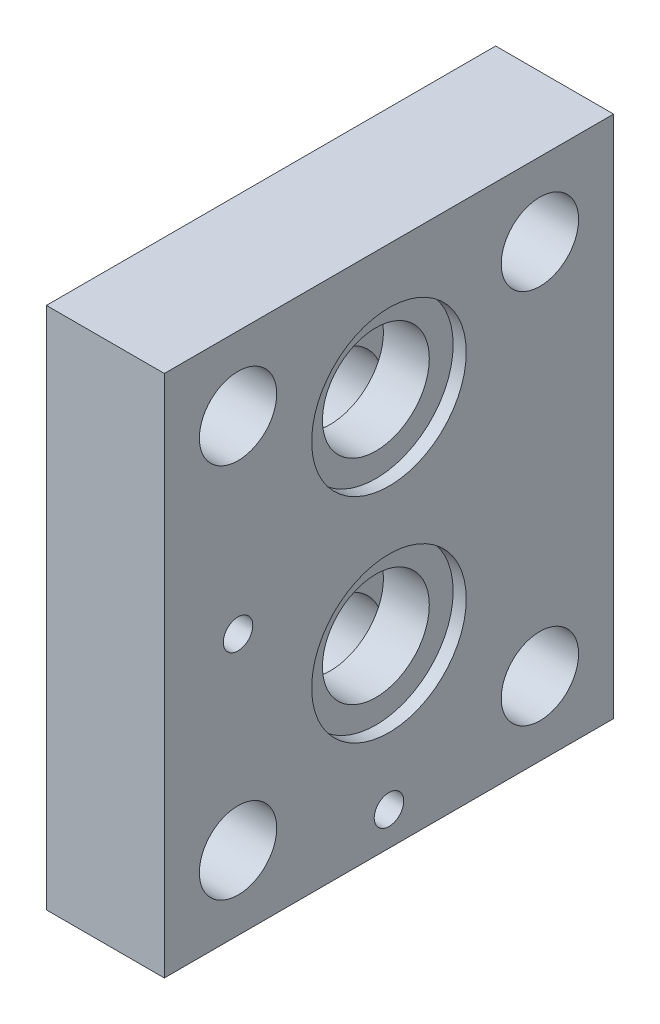
ISO-10303-21;
HEADER;
FILE_DESCRIPTION(('STEP AP214'),'2;1');
FILE_NAME('part.step','',(''),(''),'','','');
FILE_SCHEMA(('AUTOMOTIVE_DESIGN { 1 0 10303 214 1 1 1 1 }'));
ENDSEC;
DATA;
#1=APPLICATION_CONTEXT('core data for automotive mechanical design processes');
#2=APPLICATION_PROTOCOL_DEFINITION('international standard','automotive_design',2000,#1);
#3=PRODUCT_CONTEXT('',#1,'mechanical');
#4=PRODUCT('Part','Part','',(#3));
#5=PRODUCT_RELATED_PRODUCT_CATEGORY('part','',(#4));
#6=PRODUCT_DEFINITION_FORMATION('','',#4);
#7=PRODUCT_DEFINITION_CONTEXT('part definition',#1,'design');
#8=PRODUCT_DEFINITION('design','',#6,#7);
#9=PRODUCT_DEFINITION_SHAPE('','',#8);
#10=(LENGTH_UNIT() NAMED_UNIT(*) SI_UNIT(.MILLI.,.METRE.));
#11=(NAMED_UNIT(*) PLANE_ANGLE_UNIT() SI_UNIT($,.RADIAN.));
#12=(NAMED_UNIT(*) SI_UNIT($,.STERADIAN.) SOLID_ANGLE_UNIT());
#13=UNCERTAINTY_MEASURE_WITH_UNIT(LENGTH_MEASURE(1.E-05),#10,'distance_accuracy_value','');
#14=(GEOMETRIC_REPRESENTATION_CONTEXT(3) GLOBAL_UNCERTAINTY_ASSIGNED_CONTEXT((#13)) GLOBAL_UNIT_ASSIGNED_CONTEXT((#10,
#11,#12)) REPRESENTATION_CONTEXT('',''));
#15=CARTESIAN_POINT('',(0.,0.,0.));
#16=DIRECTION('',(0.,0.,1.));
#17=DIRECTION('',(1.,0.,0.));
#18=AXIS2_PLACEMENT_3D('',#15,#16,#17);
#19=CARTESIAN_POINT('',(12.7,84.201,48.387));
#20=DIRECTION('',(1.,0.,0.));
#21=DIRECTION('',(0.,0.,-1.));
#22=AXIS2_PLACEMENT_3D('',#19,#20,#21);
#23=CYLINDRICAL_SURFACE('',#22,11.509375);
#24=CARTESIAN_POINT('',(12.7,84.201,48.387));
#25=DIRECTION('',(1.,0.,0.));
#26=DIRECTION('',(0.,0.,-1.));
#27=AXIS2_PLACEMENT_3D('',#24,#25,#26);
#28=CIRCLE('',#27,11.509375);
#29=CARTESIAN_POINT('',(12.7,79.375,58.8357050341478));
#30=VERTEX_POINT('',#29);
#31=CARTESIAN_POINT('',(12.7,79.375,37.9382949658522));
#32=VERTEX_POINT('',#31);
#33=EDGE_CURVE('E100',#30,#32,#28,.T.);
#34=ORIENTED_EDGE('',*,*,#33,.F.);
#35=EDGE_CURVE('E59',#32,#30,#28,.T.);
#36=ORIENTED_EDGE('',*,*,#35,.F.);
#37=EDGE_LOOP('',(#34,#36));
#38=FACE_BOUND('',#37,.T.);
#39=CARTESIAN_POINT('',(22.5806,84.201,48.387));
#40=DIRECTION('',(1.,0.,0.));
#41=DIRECTION('',(0.,0.,-1.));
#42=AXIS2_PLACEMENT_3D('',#39,#40,#41);
#43=CIRCLE('',#42,11.509375);
#44=CARTESIAN_POINT('',(22.5806,84.201,36.877625));
#45=VERTEX_POINT('',#44);
#46=EDGE_CURVE('E47',#45,#45,#43,.F.);
#47=ORIENTED_EDGE('',*,*,#46,.F.);
#48=EDGE_LOOP('',(#47));
#49=FACE_BOUND('',#48,.T.);
#50=ADVANCED_FACE('F43',(#38,#49),#23,.F.);
#51=CARTESIAN_POINT('',(12.7,38.227,48.387));
#52=DIRECTION('',(1.,0.,0.));
#53=DIRECTION('',(0.,0.,-1.));
#54=AXIS2_PLACEMENT_3D('',#51,#52,#53);
#55=CYLINDRICAL_SURFACE('',#54,11.509375);
#56=CARTESIAN_POINT('',(12.7,38.227,48.387));
#57=DIRECTION('',(1.,0.,0.));
#58=DIRECTION('',(0.,0.,-1.));
#59=AXIS2_PLACEMENT_3D('',#56,#57,#58);
#60=CIRCLE('',#59,11.509375);
#61=CARTESIAN_POINT('',(12.7,33.401,58.8357050341478));
#62=VERTEX_POINT('',#61);
#63=CARTESIAN_POINT('',(12.7,33.401,37.9382949658522));
#64=VERTEX_POINT('',#63);
#65=EDGE_CURVE('E120',#62,#64,#60,.T.);
#66=ORIENTED_EDGE('',*,*,#65,.F.);
#67=EDGE_CURVE('E66',#64,#62,#60,.T.);
#68=ORIENTED_EDGE('',*,*,#67,.F.);
#69=EDGE_LOOP('',(#66,#68));
#70=FACE_BOUND('',#69,.T.);
#71=CARTESIAN_POINT('',(22.5806,38.227,48.387));
#72=DIRECTION('',(1.,0.,0.));
#73=DIRECTION('',(0.,0.,-1.));
#74=AXIS2_PLACEMENT_3D('',#71,#72,#73);
#75=CIRCLE('',#74,11.509375);
#76=CARTESIAN_POINT('',(22.5806,38.227,36.877625));
#77=VERTEX_POINT('',#76);
#78=EDGE_CURVE('E101',#77,#77,#75,.F.);
#79=ORIENTED_EDGE('',*,*,#78,.F.);
#80=EDGE_LOOP('',(#79));
#81=FACE_BOUND('',#80,.T.);
#82=ADVANCED_FACE('F279',(#70,#81),#55,.F.);
#83=CARTESIAN_POINT('',(25.4,0.,0.));
#84=DIRECTION('',(0.,1.,0.));
#85=DIRECTION('',(0.,0.,1.));
#86=AXIS2_PLACEMENT_3D('',#83,#84,#85);
#87=PLANE('',#86);
#88=DIRECTION('',(0.,0.,-1.));
#89=VECTOR('',#88,1.);
#90=CARTESIAN_POINT('',(0.,0.,0.));
#91=LINE('',#90,#89);
#92=CARTESIAN_POINT('',(0.,0.,96.774));
#93=VERTEX_POINT('',#92);
#94=CARTESIAN_POINT('',(0.,0.,0.));
#95=VERTEX_POINT('',#94);
#96=EDGE_CURVE('E148',#93,#95,#91,.T.);
#97=ORIENTED_EDGE('',*,*,#96,.T.);
#98=DIRECTION('',(-1.,0.,0.));
#99=VECTOR('',#98,1.);
#100=CARTESIAN_POINT('',(25.4,0.,0.));
#101=LINE('',#100,#99);
#102=CARTESIAN_POINT('',(25.4,0.,0.));
#103=VERTEX_POINT('',#102);
#104=EDGE_CURVE('E11',#103,#95,#101,.T.);
#105=ORIENTED_EDGE('',*,*,#104,.F.);
#106=DIRECTION('',(0.,0.,-1.));
#107=VECTOR('',#106,1.);
#108=CARTESIAN_POINT('',(25.4,0.,0.));
#109=LINE('',#108,#107);
#110=CARTESIAN_POINT('',(25.4,0.,96.774));
#111=VERTEX_POINT('',#110);
#112=EDGE_CURVE('E151',#111,#103,#109,.T.);
#113=ORIENTED_EDGE('',*,*,#112,.F.);
#114=DIRECTION('',(-1.,0.,0.));
#115=VECTOR('',#114,1.);
#116=CARTESIAN_POINT('',(25.4,0.,96.774));
#117=LINE('',#116,#115);
#118=EDGE_CURVE('E161',#111,#93,#117,.T.);
#119=ORIENTED_EDGE('',*,*,#118,.T.);
#120=EDGE_LOOP('',(#97,#105,#113,#119));
#121=FACE_BOUND('',#120,.T.);
#122=ADVANCED_FACE('F45',(#121),#87,.F.);
#123=CARTESIAN_POINT('',(25.4,0.,0.));
#124=DIRECTION('',(0.,0.,1.));
#125=DIRECTION('',(1.,0.,0.));
#126=AXIS2_PLACEMENT_3D('',#123,#124,#125);
#127=PLANE('',#126);
#128=DIRECTION('',(0.,1.,0.));
#129=VECTOR('',#128,1.);
#130=CARTESIAN_POINT('',(0.,0.,0.));
#131=LINE('',#130,#129);
#132=CARTESIAN_POINT('',(0.,112.776,0.));
#133=VERTEX_POINT('',#132);
#134=EDGE_CURVE('E164',#95,#133,#131,.T.);
#135=ORIENTED_EDGE('',*,*,#134,.T.);
#136=DIRECTION('',(-1.,0.,0.));
#137=VECTOR('',#136,1.);
#138=CARTESIAN_POINT('',(25.4,112.776,0.));
#139=LINE('',#138,#137);
#140=CARTESIAN_POINT('',(25.4,112.776,0.));
#141=VERTEX_POINT('',#140);
#142=EDGE_CURVE('E52',#141,#133,#139,.T.);
#143=ORIENTED_EDGE('',*,*,#142,.F.);
#144=DIRECTION('',(0.,1.,0.));
#145=VECTOR('',#144,1.);
#146=CARTESIAN_POINT('',(25.4,0.,0.));
#147=LINE('',#146,#145);
#148=EDGE_CURVE('E154',#103,#141,#147,.T.);
#149=ORIENTED_EDGE('',*,*,#148,.F.);
#150=ORIENTED_EDGE('',*,*,#104,.T.);
#151=EDGE_LOOP('',(#135,#143,#149,#150));
#152=FACE_BOUND('',#151,.T.);
#153=ADVANCED_FACE('F255',(#152),#127,.F.);
#154=CARTESIAN_POINT('',(25.4,112.776,0.));
#155=DIRECTION('',(0.,-1.,0.));
#156=DIRECTION('',(0.,0.,-1.));
#157=AXIS2_PLACEMENT_3D('',#154,#155,#156);
#158=PLANE('',#157);
#159=DIRECTION('',(0.,0.,1.));
#160=VECTOR('',#159,1.);
#161=CARTESIAN_POINT('',(0.,112.776,0.));
#162=LINE('',#161,#160);
#163=CARTESIAN_POINT('',(0.,112.776,96.774));
#164=VERTEX_POINT('',#163);
#165=EDGE_CURVE('E166',#133,#164,#162,.T.);
#166=ORIENTED_EDGE('',*,*,#165,.T.);
#167=DIRECTION('',(-1.,0.,0.));
#168=VECTOR('',#167,1.);
#169=CARTESIAN_POINT('',(25.4,112.776,96.774));
#170=LINE('',#169,#168);
#171=CARTESIAN_POINT('',(25.4,112.776,96.774));
#172=VERTEX_POINT('',#171);
#173=EDGE_CURVE('E171',#172,#164,#170,.T.);
#174=ORIENTED_EDGE('',*,*,#173,.F.);
#175=DIRECTION('',(0.,0.,1.));
#176=VECTOR('',#175,1.);
#177=CARTESIAN_POINT('',(25.4,112.776,0.));
#178=LINE('',#177,#176);
#179=EDGE_CURVE('E157',#141,#172,#178,.T.);
#180=ORIENTED_EDGE('',*,*,#179,.F.);
#181=ORIENTED_EDGE('',*,*,#142,.T.);
#182=EDGE_LOOP('',(#166,#174,#180,#181));
#183=FACE_BOUND('',#182,.T.);
#184=ADVANCED_FACE('F260',(#183),#158,.F.);
#185=CARTESIAN_POINT('',(25.4,0.,96.774));
#186=DIRECTION('',(0.,0.,-1.));
#187=DIRECTION('',(-1.,0.,0.));
#188=AXIS2_PLACEMENT_3D('',#185,#186,#187);
#189=PLANE('',#188);
#190=DIRECTION('',(0.,-1.,0.));
#191=VECTOR('',#190,1.);
#192=CARTESIAN_POINT('',(0.,0.,96.774));
#193=LINE('',#192,#191);
#194=EDGE_CURVE('E155',#164,#93,#193,.T.);
#195=ORIENTED_EDGE('',*,*,#194,.T.);
#196=ORIENTED_EDGE('',*,*,#118,.F.);
#197=DIRECTION('',(0.,-1.,0.));
#198=VECTOR('',#197,1.);
#199=CARTESIAN_POINT('',(25.4,0.,96.774));
#200=LINE('',#199,#198);
#201=EDGE_CURVE('E159',#172,#111,#200,.T.);
#202=ORIENTED_EDGE('',*,*,#201,.F.);
#203=ORIENTED_EDGE('',*,*,#173,.T.);
#204=EDGE_LOOP('',(#195,#196,#202,#203));
#205=FACE_BOUND('',#204,.T.);
#206=ADVANCED_FACE('F231',(#205),#189,.F.);
#207=CARTESIAN_POINT('',(25.4,0.,0.));
#208=DIRECTION('',(-1.,0.,0.));
#209=DIRECTION('',(0.,0.,1.));
#210=AXIS2_PLACEMENT_3D('',#207,#208,#209);
#211=PLANE('',#210);
#212=CARTESIAN_POINT('',(25.4,56.261,80.899));
#213=DIRECTION('',(1.,0.,0.));
#214=DIRECTION('',(0.,0.,-1.));
#215=AXIS2_PLACEMENT_3D('',#212,#213,#214);
#216=CIRCLE('',#215,3.175);
#217=CARTESIAN_POINT('',(25.4,56.261,77.724));
#218=VERTEX_POINT('',#217);
#219=EDGE_CURVE('E212',#218,#218,#216,.T.);
#220=ORIENTED_EDGE('',*,*,#219,.F.);
#221=EDGE_LOOP('',(#220));
#222=FACE_BOUND('',#221,.T.);
#223=CARTESIAN_POINT('',(25.4,7.239,48.387));
#224=DIRECTION('',(1.,0.,0.));
#225=DIRECTION('',(0.,0.,-1.));
#226=AXIS2_PLACEMENT_3D('',#223,#224,#225);
#227=CIRCLE('',#226,3.175);
#228=CARTESIAN_POINT('',(25.4,7.239,45.212));
#229=VERTEX_POINT('',#228);
#230=EDGE_CURVE('E206',#229,#229,#227,.T.);
#231=ORIENTED_EDGE('',*,*,#230,.F.);
#232=EDGE_LOOP('',(#231));
#233=FACE_BOUND('',#232,.T.);
#234=CARTESIAN_POINT('',(25.4,84.201,48.387));
#235=DIRECTION('',(1.,0.,0.));
#236=DIRECTION('',(0.,0.,-1.));
#237=AXIS2_PLACEMENT_3D('',#234,#235,#236);
#238=CIRCLE('',#237,16.6497);
#239=CARTESIAN_POINT('',(25.4,84.201,31.7373));
#240=VERTEX_POINT('',#239);
#241=EDGE_CURVE('E187',#240,#240,#238,.T.);
#242=ORIENTED_EDGE('',*,*,#241,.F.);
#243=EDGE_LOOP('',(#242));
#244=FACE_BOUND('',#243,.T.);
#245=CARTESIAN_POINT('',(25.4,38.227,48.387));
#246=DIRECTION('',(1.,0.,0.));
#247=DIRECTION('',(0.,0.,-1.));
#248=AXIS2_PLACEMENT_3D('',#245,#246,#247);
#249=CIRCLE('',#248,16.6497);
#250=CARTESIAN_POINT('',(25.4,38.227,31.7373));
#251=VERTEX_POINT('',#250);
#252=EDGE_CURVE('E180',#251,#251,#249,.T.);
#253=ORIENTED_EDGE('',*,*,#252,.F.);
#254=EDGE_LOOP('',(#253));
#255=FACE_BOUND('',#254,.T.);
#256=CARTESIAN_POINT('',(25.4,96.901,15.875));
#257=DIRECTION('',(1.,0.,0.));
#258=DIRECTION('',(0.,0.,-1.));
#259=AXIS2_PLACEMENT_3D('',#256,#257,#258);
#260=CIRCLE('',#259,8.334375);
#261=CARTESIAN_POINT('',(25.4,96.901,7.540625));
#262=VERTEX_POINT('',#261);
#263=EDGE_CURVE('E127',#262,#262,#260,.T.);
#264=ORIENTED_EDGE('',*,*,#263,.F.);
#265=EDGE_LOOP('',(#264));
#266=FACE_BOUND('',#265,.T.);
#267=CARTESIAN_POINT('',(25.4,15.875,80.899));
#268=DIRECTION('',(1.,0.,0.));
#269=DIRECTION('',(0.,0.,-1.));
#270=AXIS2_PLACEMENT_3D('',#267,#268,#269);
#271=CIRCLE('',#270,8.334375);
#272=CARTESIAN_POINT('',(25.4,15.875,72.564625));
#273=VERTEX_POINT('',#272);
#274=EDGE_CURVE('E137',#273,#273,#271,.T.);
#275=ORIENTED_EDGE('',*,*,#274,.F.);
#276=EDGE_LOOP('',(#275));
#277=FACE_BOUND('',#276,.T.);
#278=CARTESIAN_POINT('',(25.4,96.901,80.899));
#279=DIRECTION('',(1.,0.,0.));
#280=DIRECTION('',(0.,0.,-1.));
#281=AXIS2_PLACEMENT_3D('',#278,#279,#280);
#282=CIRCLE('',#281,8.33437500000001);
#283=CARTESIAN_POINT('',(25.4,96.901,72.564625));
#284=VERTEX_POINT('',#283);
#285=EDGE_CURVE('E125',#284,#284,#282,.T.);
#286=ORIENTED_EDGE('',*,*,#285,.F.);
#287=EDGE_LOOP('',(#286));
#288=FACE_BOUND('',#287,.T.);
#289=CARTESIAN_POINT('',(25.4,15.875,15.875));
#290=DIRECTION('',(1.,0.,0.));
#291=DIRECTION('',(0.,0.,-1.));
#292=AXIS2_PLACEMENT_3D('',#289,#290,#291);
#293=CIRCLE('',#292,8.334375);
#294=CARTESIAN_POINT('',(25.4,15.875,7.540625));
#295=VERTEX_POINT('',#294);
#296=EDGE_CURVE('E145',#295,#295,#293,.T.);
#297=ORIENTED_EDGE('',*,*,#296,.F.);
#298=EDGE_LOOP('',(#297));
#299=FACE_BOUND('',#298,.T.);
#300=ORIENTED_EDGE('',*,*,#112,.T.);
#301=ORIENTED_EDGE('',*,*,#148,.T.);
#302=ORIENTED_EDGE('',*,*,#179,.T.);
#303=ORIENTED_EDGE('',*,*,#201,.T.);
#304=EDGE_LOOP('',(#300,#301,#302,#303));
#305=FACE_BOUND('',#304,.T.);
#306=ADVANCED_FACE('F227',(#222,#233,#244,#255,#266,#277,#288,#299,#305),#211,.F.);
#307=CARTESIAN_POINT('',(0.,0.,0.));
#308=DIRECTION('',(-1.,0.,0.));
#309=DIRECTION('',(0.,0.,1.));
#310=AXIS2_PLACEMENT_3D('',#307,#308,#309);
#311=PLANE('',#310);
#312=CARTESIAN_POINT('',(0.,56.515,15.875));
#313=DIRECTION('',(1.,0.,0.));
#314=DIRECTION('',(0.,0.,-1.));
#315=AXIS2_PLACEMENT_3D('',#312,#313,#314);
#316=CIRCLE('',#315,3.571875);
#317=CARTESIAN_POINT('',(0.,56.515,12.303125));
#318=VERTEX_POINT('',#317);
#319=EDGE_CURVE('E200',#318,#318,#316,.T.);
#320=ORIENTED_EDGE('',*,*,#319,.T.);
#321=EDGE_LOOP('',(#320));
#322=FACE_BOUND('',#321,.T.);
#323=CARTESIAN_POINT('',(0.,105.537,48.387));
#324=DIRECTION('',(1.,0.,0.));
#325=DIRECTION('',(0.,0.,-1.));
#326=AXIS2_PLACEMENT_3D('',#323,#324,#325);
#327=CIRCLE('',#326,3.57187500000001);
#328=CARTESIAN_POINT('',(0.,105.537,44.815125));
#329=VERTEX_POINT('',#328);
#330=EDGE_CURVE('E194',#329,#329,#327,.T.);
#331=ORIENTED_EDGE('',*,*,#330,.T.);
#332=EDGE_LOOP('',(#331));
#333=FACE_BOUND('',#332,.T.);
#334=CARTESIAN_POINT('',(0.,74.549,48.387));
#335=DIRECTION('',(1.,0.,0.));
#336=DIRECTION('',(0.,0.,-1.));
#337=AXIS2_PLACEMENT_3D('',#334,#335,#336);
#338=CIRCLE('',#337,11.509375);
#339=CARTESIAN_POINT('',(0.,74.549,36.877625));
#340=VERTEX_POINT('',#339);
#341=EDGE_CURVE('E110',#340,#340,#338,.T.);
#342=ORIENTED_EDGE('',*,*,#341,.T.);
#343=EDGE_LOOP('',(#342));
#344=FACE_BOUND('',#343,.T.);
#345=CARTESIAN_POINT('',(0.,28.575,48.387));
#346=DIRECTION('',(1.,0.,0.));
#347=DIRECTION('',(0.,0.,-1.));
#348=AXIS2_PLACEMENT_3D('',#345,#346,#347);
#349=CIRCLE('',#348,11.509375);
#350=CARTESIAN_POINT('',(0.,28.575,36.877625));
#351=VERTEX_POINT('',#350);
#352=EDGE_CURVE('E114',#351,#351,#349,.T.);
#353=ORIENTED_EDGE('',*,*,#352,.T.);
#354=EDGE_LOOP('',(#353));
#355=FACE_BOUND('',#354,.T.);
#356=CARTESIAN_POINT('',(0.,96.901,15.875));
#357=DIRECTION('',(1.,0.,0.));
#358=DIRECTION('',(0.,0.,-1.));
#359=AXIS2_PLACEMENT_3D('',#356,#357,#358);
#360=CIRCLE('',#359,8.334375);
#361=CARTESIAN_POINT('',(0.,96.901,7.540625));
#362=VERTEX_POINT('',#361);
#363=EDGE_CURVE('E131',#362,#362,#360,.T.);
#364=ORIENTED_EDGE('',*,*,#363,.T.);
#365=EDGE_LOOP('',(#364));
#366=FACE_BOUND('',#365,.T.);
#367=CARTESIAN_POINT('',(0.,15.875,80.899));
#368=DIRECTION('',(1.,0.,0.));
#369=DIRECTION('',(0.,0.,-1.));
#370=AXIS2_PLACEMENT_3D('',#367,#368,#369);
#371=CIRCLE('',#370,8.334375);
#372=CARTESIAN_POINT('',(0.,15.875,72.564625));
#373=VERTEX_POINT('',#372);
#374=EDGE_CURVE('E134',#373,#373,#371,.T.);
#375=ORIENTED_EDGE('',*,*,#374,.T.);
#376=EDGE_LOOP('',(#375));
#377=FACE_BOUND('',#376,.T.);
#378=CARTESIAN_POINT('',(0.,96.901,80.899));
#379=DIRECTION('',(1.,0.,0.));
#380=DIRECTION('',(0.,0.,-1.));
#381=AXIS2_PLACEMENT_3D('',#378,#379,#380);
#382=CIRCLE('',#381,8.33437500000001);
#383=CARTESIAN_POINT('',(0.,96.901,72.564625));
#384=VERTEX_POINT('',#383);
#385=EDGE_CURVE('E140',#384,#384,#382,.T.);
#386=ORIENTED_EDGE('',*,*,#385,.T.);
#387=EDGE_LOOP('',(#386));
#388=FACE_BOUND('',#387,.T.);
#389=CARTESIAN_POINT('',(0.,15.875,15.875));
#390=DIRECTION('',(1.,0.,0.));
#391=DIRECTION('',(0.,0.,-1.));
#392=AXIS2_PLACEMENT_3D('',#389,#390,#391);
#393=CIRCLE('',#392,8.334375);
#394=CARTESIAN_POINT('',(0.,15.875,7.540625));
#395=VERTEX_POINT('',#394);
#396=EDGE_CURVE('E130',#395,#395,#393,.T.);
#397=ORIENTED_EDGE('',*,*,#396,.T.);
#398=EDGE_LOOP('',(#397));
#399=FACE_BOUND('',#398,.T.);
#400=ORIENTED_EDGE('',*,*,#96,.F.);
#401=ORIENTED_EDGE('',*,*,#194,.F.);
#402=ORIENTED_EDGE('',*,*,#165,.F.);
#403=ORIENTED_EDGE('',*,*,#134,.F.);
#404=EDGE_LOOP('',(#400,#401,#402,#403));
#405=FACE_BOUND('',#404,.T.);
#406=ADVANCED_FACE('F230',(#322,#333,#344,#355,#366,#377,#388,#399,#405),#311,.T.);
#407=CARTESIAN_POINT('',(25.4,15.875,15.875));
#408=DIRECTION('',(-1.,0.,0.));
#409=DIRECTION('',(0.,0.,1.));
#410=AXIS2_PLACEMENT_3D('',#407,#408,#409);
#411=CYLINDRICAL_SURFACE('',#410,8.334375);
#412=ORIENTED_EDGE('',*,*,#296,.T.);
#413=EDGE_LOOP('',(#412));
#414=FACE_BOUND('',#413,.T.);
#415=ORIENTED_EDGE('',*,*,#396,.F.);
#416=EDGE_LOOP('',(#415));
#417=FACE_BOUND('',#416,.T.);
#418=ADVANCED_FACE('F265',(#414,#417),#411,.F.);
#419=CARTESIAN_POINT('',(25.4,96.901,80.899));
#420=DIRECTION('',(-1.,0.,0.));
#421=DIRECTION('',(0.,0.,1.));
#422=AXIS2_PLACEMENT_3D('',#419,#420,#421);
#423=CYLINDRICAL_SURFACE('',#422,8.33437500000001);
#424=ORIENTED_EDGE('',*,*,#285,.T.);
#425=EDGE_LOOP('',(#424));
#426=FACE_BOUND('',#425,.T.);
#427=ORIENTED_EDGE('',*,*,#385,.F.);
#428=EDGE_LOOP('',(#427));
#429=FACE_BOUND('',#428,.T.);
#430=ADVANCED_FACE('F273',(#426,#429),#423,.F.);
#431=CARTESIAN_POINT('',(25.4,15.875,80.899));
#432=DIRECTION('',(-1.,0.,0.));
#433=DIRECTION('',(0.,0.,1.));
#434=AXIS2_PLACEMENT_3D('',#431,#432,#433);
#435=CYLINDRICAL_SURFACE('',#434,8.334375);
#436=ORIENTED_EDGE('',*,*,#274,.T.);
#437=EDGE_LOOP('',(#436));
#438=FACE_BOUND('',#437,.T.);
#439=ORIENTED_EDGE('',*,*,#374,.F.);
#440=EDGE_LOOP('',(#439));
#441=FACE_BOUND('',#440,.T.);
#442=ADVANCED_FACE('F309',(#438,#441),#435,.F.);
#443=CARTESIAN_POINT('',(25.4,96.901,15.875));
#444=DIRECTION('',(-1.,0.,0.));
#445=DIRECTION('',(0.,0.,1.));
#446=AXIS2_PLACEMENT_3D('',#443,#444,#445);
#447=CYLINDRICAL_SURFACE('',#446,8.334375);
#448=ORIENTED_EDGE('',*,*,#263,.T.);
#449=EDGE_LOOP('',(#448));
#450=FACE_BOUND('',#449,.T.);
#451=ORIENTED_EDGE('',*,*,#363,.F.);
#452=EDGE_LOOP('',(#451));
#453=FACE_BOUND('',#452,.T.);
#454=ADVANCED_FACE('F305',(#450,#453),#447,.F.);
#455=CARTESIAN_POINT('',(12.7,28.575,48.387));
#456=DIRECTION('',(-1.,0.,0.));
#457=DIRECTION('',(0.,0.,1.));
#458=AXIS2_PLACEMENT_3D('',#455,#456,#457);
#459=CYLINDRICAL_SURFACE('',#458,11.509375);
#460=CARTESIAN_POINT('',(12.7,28.575,48.387));
#461=DIRECTION('',(1.,0.,0.));
#462=DIRECTION('',(0.,0.,-1.));
#463=AXIS2_PLACEMENT_3D('',#460,#461,#462);
#464=CIRCLE('',#463,11.509375);
#465=EDGE_CURVE('E123',#64,#62,#464,.T.);
#466=ORIENTED_EDGE('',*,*,#465,.T.);
#467=EDGE_CURVE('E116',#62,#64,#464,.T.);
#468=ORIENTED_EDGE('',*,*,#467,.T.);
#469=EDGE_LOOP('',(#466,#468));
#470=FACE_BOUND('',#469,.T.);
#471=ORIENTED_EDGE('',*,*,#352,.F.);
#472=EDGE_LOOP('',(#471));
#473=FACE_BOUND('',#472,.T.);
#474=ADVANCED_FACE('F301',(#470,#473),#459,.F.);
#475=CARTESIAN_POINT('',(12.7,28.575,48.387));
#476=DIRECTION('',(1.,0.,0.));
#477=DIRECTION('',(0.,0.,-1.));
#478=AXIS2_PLACEMENT_3D('',#475,#476,#477);
#479=PLANE('',#478);
#480=ORIENTED_EDGE('',*,*,#467,.F.);
#481=ORIENTED_EDGE('',*,*,#65,.T.);
#482=EDGE_LOOP('',(#480,#481));
#483=FACE_BOUND('',#482,.T.);
#484=ADVANCED_FACE('F298',(#483),#479,.F.);
#485=CARTESIAN_POINT('',(12.7,74.549,48.387));
#486=DIRECTION('',(-1.,0.,0.));
#487=DIRECTION('',(0.,0.,1.));
#488=AXIS2_PLACEMENT_3D('',#485,#486,#487);
#489=CYLINDRICAL_SURFACE('',#488,11.509375);
#490=CARTESIAN_POINT('',(12.7,74.549,48.387));
#491=DIRECTION('',(1.,0.,0.));
#492=DIRECTION('',(0.,0.,-1.));
#493=AXIS2_PLACEMENT_3D('',#490,#491,#492);
#494=CIRCLE('',#493,11.509375);
#495=EDGE_CURVE('E98',#32,#30,#494,.T.);
#496=ORIENTED_EDGE('',*,*,#495,.T.);
#497=EDGE_CURVE('E107',#30,#32,#494,.T.);
#498=ORIENTED_EDGE('',*,*,#497,.T.);
#499=EDGE_LOOP('',(#496,#498));
#500=FACE_BOUND('',#499,.T.);
#501=ORIENTED_EDGE('',*,*,#341,.F.);
#502=EDGE_LOOP('',(#501));
#503=FACE_BOUND('',#502,.T.);
#504=ADVANCED_FACE('F112',(#500,#503),#489,.F.);
#505=CARTESIAN_POINT('',(12.7,74.549,48.387));
#506=DIRECTION('',(1.,0.,0.));
#507=DIRECTION('',(0.,0.,-1.));
#508=AXIS2_PLACEMENT_3D('',#505,#506,#507);
#509=PLANE('',#508);
#510=ORIENTED_EDGE('',*,*,#497,.F.);
#511=ORIENTED_EDGE('',*,*,#33,.T.);
#512=EDGE_LOOP('',(#510,#511));
#513=FACE_BOUND('',#512,.T.);
#514=ADVANCED_FACE('F108',(#513),#509,.F.);
#515=CARTESIAN_POINT('',(12.7,38.227,48.387));
#516=DIRECTION('',(1.,0.,0.));
#517=DIRECTION('',(0.,0.,-1.));
#518=AXIS2_PLACEMENT_3D('',#515,#516,#517);
#519=PLANE('',#518);
#520=ORIENTED_EDGE('',*,*,#67,.T.);
#521=ORIENTED_EDGE('',*,*,#465,.F.);
#522=EDGE_LOOP('',(#520,#521));
#523=FACE_BOUND('',#522,.T.);
#524=ADVANCED_FACE('F290',(#523),#519,.T.);
#525=CARTESIAN_POINT('',(12.7,84.201,48.387));
#526=DIRECTION('',(1.,0.,0.));
#527=DIRECTION('',(0.,0.,-1.));
#528=AXIS2_PLACEMENT_3D('',#525,#526,#527);
#529=PLANE('',#528);
#530=ORIENTED_EDGE('',*,*,#35,.T.);
#531=ORIENTED_EDGE('',*,*,#495,.F.);
#532=EDGE_LOOP('',(#530,#531));
#533=FACE_BOUND('',#532,.T.);
#534=ADVANCED_FACE('F96',(#533),#529,.T.);
#535=CARTESIAN_POINT('',(22.5806,38.227,48.387));
#536=DIRECTION('',(1.,0.,0.));
#537=DIRECTION('',(0.,0.,-1.));
#538=AXIS2_PLACEMENT_3D('',#535,#536,#537);
#539=PLANE('',#538);
#540=CARTESIAN_POINT('',(22.5806,38.227,48.387));
#541=DIRECTION('',(1.,0.,0.));
#542=DIRECTION('',(0.,0.,-1.));
#543=AXIS2_PLACEMENT_3D('',#540,#541,#542);
#544=CIRCLE('',#543,16.6497);
#545=CARTESIAN_POINT('',(22.5806,38.227,31.7373));
#546=VERTEX_POINT('',#545);
#547=EDGE_CURVE('E176',#546,#546,#544,.T.);
#548=ORIENTED_EDGE('',*,*,#547,.T.);
#549=EDGE_LOOP('',(#548));
#550=FACE_BOUND('',#549,.T.);
#551=ORIENTED_EDGE('',*,*,#78,.T.);
#552=EDGE_LOOP('',(#551));
#553=FACE_BOUND('',#552,.T.);
#554=ADVANCED_FACE('F368',(#550,#553),#539,.T.);
#555=CARTESIAN_POINT('',(22.5806,38.227,48.387));
#556=DIRECTION('',(1.,0.,0.));
#557=DIRECTION('',(0.,0.,-1.));
#558=AXIS2_PLACEMENT_3D('',#555,#556,#557);
#559=CYLINDRICAL_SURFACE('',#558,16.6497);
#560=ORIENTED_EDGE('',*,*,#547,.F.);
#561=EDGE_LOOP('',(#560));
#562=FACE_BOUND('',#561,.T.);
#563=ORIENTED_EDGE('',*,*,#252,.T.);
#564=EDGE_LOOP('',(#563));
#565=FACE_BOUND('',#564,.T.);
#566=ADVANCED_FACE('F380',(#562,#565),#559,.F.);
#567=CARTESIAN_POINT('',(22.5806,84.201,48.387));
#568=DIRECTION('',(1.,0.,0.));
#569=DIRECTION('',(0.,0.,-1.));
#570=AXIS2_PLACEMENT_3D('',#567,#568,#569);
#571=PLANE('',#570);
#572=CARTESIAN_POINT('',(22.5806,84.201,48.387));
#573=DIRECTION('',(1.,0.,0.));
#574=DIRECTION('',(0.,0.,-1.));
#575=AXIS2_PLACEMENT_3D('',#572,#573,#574);
#576=CIRCLE('',#575,16.6497);
#577=CARTESIAN_POINT('',(22.5806,84.201,31.7373));
#578=VERTEX_POINT('',#577);
#579=EDGE_CURVE('E190',#578,#578,#576,.T.);
#580=ORIENTED_EDGE('',*,*,#579,.T.);
#581=EDGE_LOOP('',(#580));
#582=FACE_BOUND('',#581,.T.);
#583=ORIENTED_EDGE('',*,*,#46,.T.);
#584=EDGE_LOOP('',(#583));
#585=FACE_BOUND('',#584,.T.);
#586=ADVANCED_FACE('F386',(#582,#585),#571,.T.);
#587=CARTESIAN_POINT('',(22.5806,84.201,48.387));
#588=DIRECTION('',(1.,0.,0.));
#589=DIRECTION('',(0.,0.,-1.));
#590=AXIS2_PLACEMENT_3D('',#587,#588,#589);
#591=CYLINDRICAL_SURFACE('',#590,16.6497);
#592=ORIENTED_EDGE('',*,*,#579,.F.);
#593=EDGE_LOOP('',(#592));
#594=FACE_BOUND('',#593,.T.);
#595=ORIENTED_EDGE('',*,*,#241,.T.);
#596=EDGE_LOOP('',(#595));
#597=FACE_BOUND('',#596,.T.);
#598=ADVANCED_FACE('F401',(#594,#597),#591,.F.);
#599=CARTESIAN_POINT('',(7.874,105.537,48.387));
#600=DIRECTION('',(-1.,0.,0.));
#601=DIRECTION('',(0.,0.,1.));
#602=AXIS2_PLACEMENT_3D('',#599,#600,#601);
#603=CYLINDRICAL_SURFACE('',#602,3.57187500000001);
#604=CARTESIAN_POINT('',(7.874,105.537,48.387));
#605=DIRECTION('',(1.,0.,0.));
#606=DIRECTION('',(0.,0.,-1.));
#607=AXIS2_PLACEMENT_3D('',#604,#605,#606);
#608=CIRCLE('',#607,3.57187500000001);
#609=CARTESIAN_POINT('',(7.874,105.537,44.815125));
#610=VERTEX_POINT('',#609);
#611=EDGE_CURVE('E191',#610,#610,#608,.T.);
#612=ORIENTED_EDGE('',*,*,#611,.T.);
#613=EDGE_LOOP('',(#612));
#614=FACE_BOUND('',#613,.T.);
#615=ORIENTED_EDGE('',*,*,#330,.F.);
#616=EDGE_LOOP('',(#615));
#617=FACE_BOUND('',#616,.T.);
#618=ADVANCED_FACE('F411',(#614,#617),#603,.F.);
#619=CARTESIAN_POINT('',(7.874,105.537,48.387));
#620=DIRECTION('',(1.,0.,0.));
#621=DIRECTION('',(0.,0.,-1.));
#622=AXIS2_PLACEMENT_3D('',#619,#620,#621);
#623=PLANE('',#622);
#624=ORIENTED_EDGE('',*,*,#611,.F.);
#625=EDGE_LOOP('',(#624));
#626=FACE_BOUND('',#625,.T.);
#627=ADVANCED_FACE('F421',(#626),#623,.F.);
#628=CARTESIAN_POINT('',(7.874,56.515,15.875));
#629=DIRECTION('',(-1.,0.,0.));
#630=DIRECTION('',(0.,0.,1.));
#631=AXIS2_PLACEMENT_3D('',#628,#629,#630);
#632=CYLINDRICAL_SURFACE('',#631,3.571875);
#633=CARTESIAN_POINT('',(7.874,56.515,15.875));
#634=DIRECTION('',(1.,0.,0.));
#635=DIRECTION('',(0.,0.,-1.));
#636=AXIS2_PLACEMENT_3D('',#633,#634,#635);
#637=CIRCLE('',#636,3.571875);
#638=CARTESIAN_POINT('',(7.874,56.515,12.303125));
#639=VERTEX_POINT('',#638);
#640=EDGE_CURVE('E197',#639,#639,#637,.T.);
#641=ORIENTED_EDGE('',*,*,#640,.T.);
#642=EDGE_LOOP('',(#641));
#643=FACE_BOUND('',#642,.T.);
#644=ORIENTED_EDGE('',*,*,#319,.F.);
#645=EDGE_LOOP('',(#644));
#646=FACE_BOUND('',#645,.T.);
#647=ADVANCED_FACE('F430',(#643,#646),#632,.F.);
#648=CARTESIAN_POINT('',(7.874,56.515,15.875));
#649=DIRECTION('',(1.,0.,0.));
#650=DIRECTION('',(0.,0.,-1.));
#651=AXIS2_PLACEMENT_3D('',#648,#649,#650);
#652=PLANE('',#651);
#653=ORIENTED_EDGE('',*,*,#640,.F.);
#654=EDGE_LOOP('',(#653));
#655=FACE_BOUND('',#654,.T.);
#656=ADVANCED_FACE('F439',(#655),#652,.F.);
#657=CARTESIAN_POINT('',(17.526,7.239,48.387));
#658=DIRECTION('',(1.,0.,0.));
#659=DIRECTION('',(0.,0.,-1.));
#660=AXIS2_PLACEMENT_3D('',#657,#658,#659);
#661=CYLINDRICAL_SURFACE('',#660,3.175);
#662=CARTESIAN_POINT('',(17.526,7.239,48.387));
#663=DIRECTION('',(1.,0.,0.));
#664=DIRECTION('',(0.,0.,-1.));
#665=AXIS2_PLACEMENT_3D('',#662,#663,#664);
#666=CIRCLE('',#665,3.175);
#667=CARTESIAN_POINT('',(17.526,7.239,45.212));
#668=VERTEX_POINT('',#667);
#669=EDGE_CURVE('E203',#668,#668,#666,.T.);
#670=ORIENTED_EDGE('',*,*,#669,.F.);
#671=EDGE_LOOP('',(#670));
#672=FACE_BOUND('',#671,.T.);
#673=ORIENTED_EDGE('',*,*,#230,.T.);
#674=EDGE_LOOP('',(#673));
#675=FACE_BOUND('',#674,.T.);
#676=ADVANCED_FACE('F449',(#672,#675),#661,.F.);
#677=CARTESIAN_POINT('',(17.526,7.239,48.387));
#678=DIRECTION('',(1.,0.,0.));
#679=DIRECTION('',(0.,0.,-1.));
#680=AXIS2_PLACEMENT_3D('',#677,#678,#679);
#681=PLANE('',#680);
#682=ORIENTED_EDGE('',*,*,#669,.T.);
#683=EDGE_LOOP('',(#682));
#684=FACE_BOUND('',#683,.T.);
#685=ADVANCED_FACE('F223',(#684),#681,.T.);
#686=CARTESIAN_POINT('',(17.526,56.261,80.899));
#687=DIRECTION('',(1.,0.,0.));
#688=DIRECTION('',(0.,0.,-1.));
#689=AXIS2_PLACEMENT_3D('',#686,#687,#688);
#690=CYLINDRICAL_SURFACE('',#689,3.175);
#691=CARTESIAN_POINT('',(17.526,56.261,80.899));
#692=DIRECTION('',(1.,0.,0.));
#693=DIRECTION('',(0.,0.,-1.));
#694=AXIS2_PLACEMENT_3D('',#691,#692,#693);
#695=CIRCLE('',#694,3.175);
#696=CARTESIAN_POINT('',(17.526,56.261,77.724));
#697=VERTEX_POINT('',#696);
#698=EDGE_CURVE('E209',#697,#697,#695,.T.);
#699=ORIENTED_EDGE('',*,*,#698,.F.);
#700=EDGE_LOOP('',(#699));
#701=FACE_BOUND('',#700,.T.);
#702=ORIENTED_EDGE('',*,*,#219,.T.);
#703=EDGE_LOOP('',(#702));
#704=FACE_BOUND('',#703,.T.);
#705=ADVANCED_FACE('F220',(#701,#704),#690,.F.);
#706=CARTESIAN_POINT('',(17.526,56.261,80.899));
#707=DIRECTION('',(1.,0.,0.));
#708=DIRECTION('',(0.,0.,-1.));
#709=AXIS2_PLACEMENT_3D('',#706,#707,#708);
#710=PLANE('',#709);
#711=ORIENTED_EDGE('',*,*,#698,.T.);
#712=EDGE_LOOP('',(#711));
#713=FACE_BOUND('',#712,.T.);
#714=ADVANCED_FACE('F218',(#713),#710,.T.);
#715=CLOSED_SHELL('',(#50,#82,#122,#153,#184,#206,#306,#406,#418,#430,#442,#454,#474,#484,#504,
#514,#524,#534,#554,#566,#586,#598,#618,#627,#647,#656,#676,#685,#705,#714));
#716=MANIFOLD_SOLID_BREP('B2',#715);
#717=ADVANCED_BREP_SHAPE_REPRESENTATION('',(#18,#716),#14);
#718=SHAPE_DEFINITION_REPRESENTATION(#9,#717);
ENDSEC;
END-ISO-10303-21;
